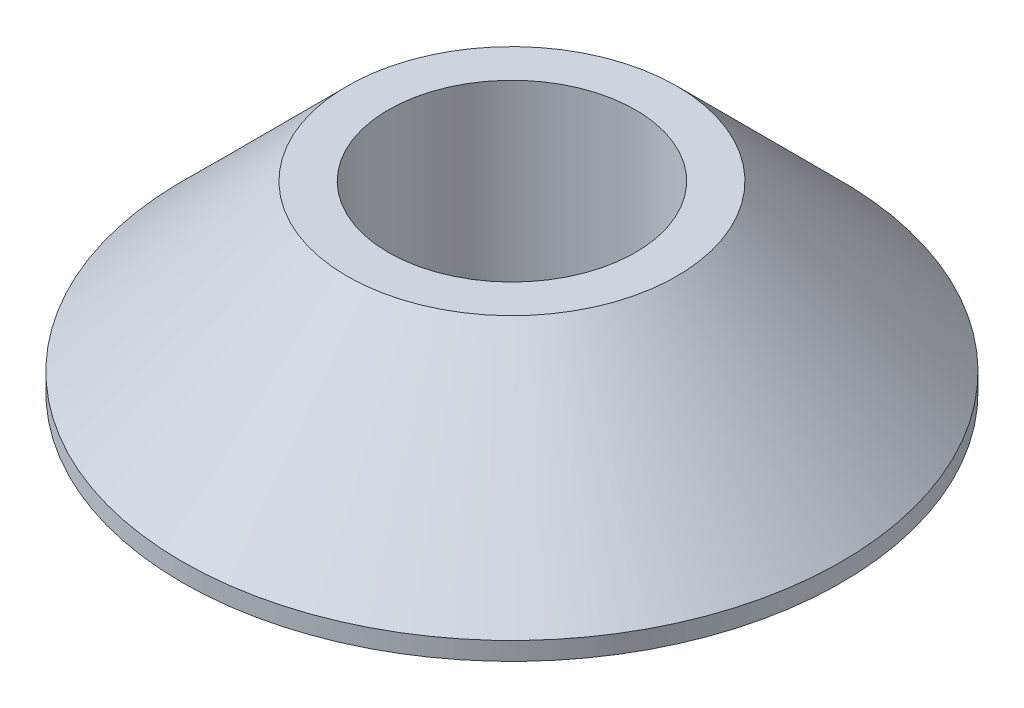
ISO-10303-21;
HEADER;
FILE_DESCRIPTION(('STEP AP214'),'2;1');
FILE_NAME('part.step','',(''),(''),'','','');
FILE_SCHEMA(('AUTOMOTIVE_DESIGN { 1 0 10303 214 1 1 1 1 }'));
ENDSEC;
DATA;
#1=APPLICATION_CONTEXT('core data for automotive mechanical design processes');
#2=APPLICATION_PROTOCOL_DEFINITION('international standard','automotive_design',2000,#1);
#3=PRODUCT_CONTEXT('',#1,'mechanical');
#4=PRODUCT('Part','Part','',(#3));
#5=PRODUCT_RELATED_PRODUCT_CATEGORY('part','',(#4));
#6=PRODUCT_DEFINITION_FORMATION('','',#4);
#7=PRODUCT_DEFINITION_CONTEXT('part definition',#1,'design');
#8=PRODUCT_DEFINITION('design','',#6,#7);
#9=PRODUCT_DEFINITION_SHAPE('','',#8);
#10=(LENGTH_UNIT() NAMED_UNIT(*) SI_UNIT(.MILLI.,.METRE.));
#11=(NAMED_UNIT(*) PLANE_ANGLE_UNIT() SI_UNIT($,.RADIAN.));
#12=(NAMED_UNIT(*) SI_UNIT($,.STERADIAN.) SOLID_ANGLE_UNIT());
#13=UNCERTAINTY_MEASURE_WITH_UNIT(LENGTH_MEASURE(1.E-05),#10,'distance_accuracy_value','');
#14=(GEOMETRIC_REPRESENTATION_CONTEXT(3) GLOBAL_UNCERTAINTY_ASSIGNED_CONTEXT((#13)) GLOBAL_UNIT_ASSIGNED_CONTEXT((#10,
#11,#12)) REPRESENTATION_CONTEXT('',''));
#15=CARTESIAN_POINT('',(0.,0.,0.));
#16=DIRECTION('',(0.,0.,1.));
#17=DIRECTION('',(1.,0.,0.));
#18=AXIS2_PLACEMENT_3D('',#15,#16,#17);
#19=CARTESIAN_POINT('',(0.,0.6985,0.));
#20=DIRECTION('',(0.,-1.,0.));
#21=DIRECTION('',(0.,0.,-1.));
#22=AXIS2_PLACEMENT_3D('',#19,#20,#21);
#23=CYLINDRICAL_SURFACE('',#22,12.7);
#24=CARTESIAN_POINT('',(0.,0.6985,0.));
#25=DIRECTION('',(0.,1.,0.));
#26=DIRECTION('',(0.,0.,1.));
#27=AXIS2_PLACEMENT_3D('',#24,#25,#26);
#28=CIRCLE('',#27,12.7);
#29=CARTESIAN_POINT('',(0.,0.6985,12.7));
#30=VERTEX_POINT('',#29);
#31=EDGE_CURVE('E10',#30,#30,#28,.T.);
#32=ORIENTED_EDGE('',*,*,#31,.F.);
#33=EDGE_LOOP('',(#32));
#34=FACE_BOUND('',#33,.T.);
#35=CARTESIAN_POINT('',(0.,0.,0.));
#36=DIRECTION('',(0.,1.,0.));
#37=DIRECTION('',(0.,0.,1.));
#38=AXIS2_PLACEMENT_3D('',#35,#36,#37);
#39=CIRCLE('',#38,12.7);
#40=CARTESIAN_POINT('',(0.,0.,12.7));
#41=VERTEX_POINT('',#40);
#42=EDGE_CURVE('E33',#41,#41,#39,.T.);
#43=ORIENTED_EDGE('',*,*,#42,.T.);
#44=EDGE_LOOP('',(#43));
#45=FACE_BOUND('',#44,.T.);
#46=ADVANCED_FACE('F30',(#34,#45),#23,.T.);
#47=CARTESIAN_POINT('',(0.,0.,0.));
#48=DIRECTION('',(0.,1.,0.));
#49=DIRECTION('',(0.,0.,1.));
#50=AXIS2_PLACEMENT_3D('',#47,#48,#49);
#51=PLANE('',#50);
#52=CARTESIAN_POINT('',(0.,0.,0.));
#53=DIRECTION('',(0.,1.,0.));
#54=DIRECTION('',(0.,0.,1.));
#55=AXIS2_PLACEMENT_3D('',#52,#53,#54);
#56=CIRCLE('',#55,4.7625);
#57=CARTESIAN_POINT('',(0.,0.,4.7625));
#58=VERTEX_POINT('',#57);
#59=EDGE_CURVE('E44',#58,#58,#56,.T.);
#60=ORIENTED_EDGE('',*,*,#59,.T.);
#61=EDGE_LOOP('',(#60));
#62=FACE_BOUND('',#61,.T.);
#63=ORIENTED_EDGE('',*,*,#42,.F.);
#64=EDGE_LOOP('',(#63));
#65=FACE_BOUND('',#64,.T.);
#66=ADVANCED_FACE('F51',(#62,#65),#51,.F.);
#67=CARTESIAN_POINT('',(0.,0.6985,0.));
#68=DIRECTION('',(0.,-1.,0.));
#69=DIRECTION('',(0.,0.,1.));
#70=AXIS2_PLACEMENT_3D('',#67,#68,#69);
#71=CONICAL_SURFACE('',#70,12.7,0.78539816339745);
#72=CARTESIAN_POINT('',(0.,7.0485,0.));
#73=DIRECTION('',(0.,1.,0.));
#74=DIRECTION('',(0.,0.,1.));
#75=AXIS2_PLACEMENT_3D('',#72,#73,#74);
#76=CIRCLE('',#75,6.34999999999998);
#77=CARTESIAN_POINT('',(0.,7.0485,6.34999999999998));
#78=VERTEX_POINT('',#77);
#79=EDGE_CURVE('E40',#78,#78,#76,.T.);
#80=ORIENTED_EDGE('',*,*,#79,.F.);
#81=EDGE_LOOP('',(#80));
#82=FACE_BOUND('',#81,.T.);
#83=ORIENTED_EDGE('',*,*,#31,.T.);
#84=EDGE_LOOP('',(#83));
#85=FACE_BOUND('',#84,.T.);
#86=ADVANCED_FACE('F63',(#82,#85),#71,.T.);
#87=CARTESIAN_POINT('',(0.,7.0485,0.));
#88=DIRECTION('',(0.,1.,0.));
#89=DIRECTION('',(0.,0.,1.));
#90=AXIS2_PLACEMENT_3D('',#87,#88,#89);
#91=PLANE('',#90);
#92=CARTESIAN_POINT('',(0.,7.0485,0.));
#93=DIRECTION('',(0.,1.,0.));
#94=DIRECTION('',(0.,0.,1.));
#95=AXIS2_PLACEMENT_3D('',#92,#93,#94);
#96=CIRCLE('',#95,4.7625);
#97=CARTESIAN_POINT('',(0.,7.0485,4.7625));
#98=VERTEX_POINT('',#97);
#99=EDGE_CURVE('E45',#98,#98,#96,.T.);
#100=ORIENTED_EDGE('',*,*,#99,.F.);
#101=EDGE_LOOP('',(#100));
#102=FACE_BOUND('',#101,.T.);
#103=ORIENTED_EDGE('',*,*,#79,.T.);
#104=EDGE_LOOP('',(#103));
#105=FACE_BOUND('',#104,.T.);
#106=ADVANCED_FACE('F57',(#102,#105),#91,.T.);
#107=CARTESIAN_POINT('',(0.,0.,0.));
#108=DIRECTION('',(0.,1.,0.));
#109=DIRECTION('',(0.,0.,1.));
#110=AXIS2_PLACEMENT_3D('',#107,#108,#109);
#111=CYLINDRICAL_SURFACE('',#110,4.7625);
#112=ORIENTED_EDGE('',*,*,#59,.F.);
#113=EDGE_LOOP('',(#112));
#114=FACE_BOUND('',#113,.T.);
#115=ORIENTED_EDGE('',*,*,#99,.T.);
#116=EDGE_LOOP('',(#115));
#117=FACE_BOUND('',#116,.T.);
#118=ADVANCED_FACE('F54',(#114,#117),#111,.F.);
#119=CLOSED_SHELL('',(#46,#66,#86,#106,#118));
#120=MANIFOLD_SOLID_BREP('B2',#119);
#121=ADVANCED_BREP_SHAPE_REPRESENTATION('',(#18,#120),#14);
#122=SHAPE_DEFINITION_REPRESENTATION(#9,#121);
ENDSEC;
END-ISO-10303-21;
